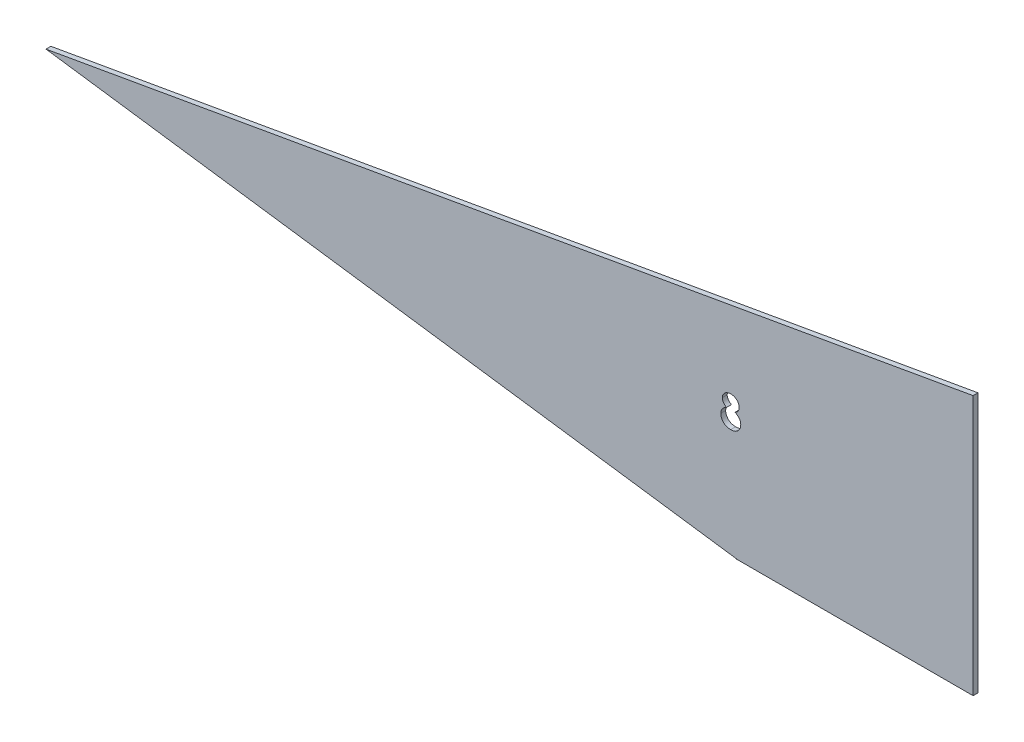
ISO-10303-21;
HEADER;
FILE_DESCRIPTION(('STEP AP214'),'2;1');
FILE_NAME('part.step','',(''),(''),'','','');
FILE_SCHEMA(('AUTOMOTIVE_DESIGN { 1 0 10303 214 1 1 1 1 }'));
ENDSEC;
DATA;
#1=APPLICATION_CONTEXT('core data for automotive mechanical design processes');
#2=APPLICATION_PROTOCOL_DEFINITION('international standard','automotive_design',2000,#1);
#3=PRODUCT_CONTEXT('',#1,'mechanical');
#4=PRODUCT('Part','Part','',(#3));
#5=PRODUCT_RELATED_PRODUCT_CATEGORY('part','',(#4));
#6=PRODUCT_DEFINITION_FORMATION('','',#4);
#7=PRODUCT_DEFINITION_CONTEXT('part definition',#1,'design');
#8=PRODUCT_DEFINITION('design','',#6,#7);
#9=PRODUCT_DEFINITION_SHAPE('','',#8);
#10=(LENGTH_UNIT() NAMED_UNIT(*) SI_UNIT(.MILLI.,.METRE.));
#11=(NAMED_UNIT(*) PLANE_ANGLE_UNIT() SI_UNIT($,.RADIAN.));
#12=(NAMED_UNIT(*) SI_UNIT($,.STERADIAN.) SOLID_ANGLE_UNIT());
#13=UNCERTAINTY_MEASURE_WITH_UNIT(LENGTH_MEASURE(1.E-05),#10,'distance_accuracy_value','');
#14=(GEOMETRIC_REPRESENTATION_CONTEXT(3) GLOBAL_UNCERTAINTY_ASSIGNED_CONTEXT((#13)) GLOBAL_UNIT_ASSIGNED_CONTEXT((#10,
#11,#12)) REPRESENTATION_CONTEXT('',''));
#15=CARTESIAN_POINT('',(0.,0.,0.));
#16=DIRECTION('',(0.,0.,1.));
#17=DIRECTION('',(1.,0.,0.));
#18=AXIS2_PLACEMENT_3D('',#15,#16,#17);
#19=CARTESIAN_POINT('',(-105.782232215349,263.577393181168,701.675));
#20=CARTESIAN_POINT('',(-105.626302265862,263.496088020879,701.675));
#21=CARTESIAN_POINT('',(-105.322186788924,263.337515805085,701.675));
#22=CARTESIAN_POINT('',(-104.889059412808,263.082186871524,701.675));
#23=CARTESIAN_POINT('',(-104.493227620286,262.81308676275,701.675));
#24=CARTESIAN_POINT('',(-104.123708991126,262.542925870805,701.675));
#25=CARTESIAN_POINT('',(-103.786995610307,262.261357882477,701.675));
#26=CARTESIAN_POINT('',(-103.486852448887,261.967263132259,701.675));
#27=CARTESIAN_POINT('',(-103.215865546191,261.667982487156,701.675));
#28=CARTESIAN_POINT('',(-102.979499764763,261.358448071402,701.675));
#29=CARTESIAN_POINT('',(-102.771599839192,261.03948222419,701.675));
#30=CARTESIAN_POINT('',(-102.591919503298,260.710247752345,701.675));
#31=CARTESIAN_POINT('',(-102.438337299309,260.371466178536,701.675));
#32=CARTESIAN_POINT('',(-102.316619018523,260.019439432744,701.675));
#33=CARTESIAN_POINT('',(-102.216351838035,259.659338580005,701.675));
#34=CARTESIAN_POINT('',(-102.147360330593,259.286513850209,701.675));
#35=CARTESIAN_POINT('',(-102.110256820757,258.903421937621,701.675));
#36=CARTESIAN_POINT('',(-102.103241993313,258.644514467027,701.675));
#37=CARTESIAN_POINT('',(-102.099690148042,258.513420825398,701.675));
#38=B_SPLINE_CURVE_WITH_KNOTS('',3,(#19,#20,#21,#22,#23,#24,#25,#26,#27,#28,#29,#30,#31,#32,#33,
#34,#35,#36,#37),.UNSPECIFIED.,.F.,.F.,(4,1,1,1,1,1,1,1,1,1,1,1,1,1,1,1,4),(0.,
0.0795248295850149,0.155099976349537,0.227219820073269,0.295910504191472,0.362055880947179,
0.425520116912639,0.485812719225311,0.544494706001814,0.601459635722228,0.657840593796651,
0.713974472193142,0.769467951597453,0.826129967181328,0.882885359309069,0.940700881666205,1.),.UNSPECIFIED.);
#39=DIRECTION('',(0.,0.,1.));
#40=VECTOR('',#39,1.);
#41=SURFACE_OF_LINEAR_EXTRUSION('',#38,#40);
#42=DIRECTION('',(0.,0.,1.));
#43=VECTOR('',#42,1.);
#44=CARTESIAN_POINT('',(-105.782232215349,263.577393181168,701.675));
#45=LINE('',#44,#43);
#46=CARTESIAN_POINT('',(-105.782232215349,263.577393181168,698.5));
#47=VERTEX_POINT('',#46);
#48=CARTESIAN_POINT('',(-105.782232215349,263.577393181168,701.675));
#49=VERTEX_POINT('',#48);
#50=EDGE_CURVE('E11',#47,#49,#45,.T.);
#51=ORIENTED_EDGE('',*,*,#50,.F.);
#52=CARTESIAN_POINT('',(-105.782232215349,263.577393181168,698.5));
#53=CARTESIAN_POINT('',(-105.626302265862,263.496088020879,698.5));
#54=CARTESIAN_POINT('',(-105.322186788924,263.337515805085,698.5));
#55=CARTESIAN_POINT('',(-104.889059412808,263.082186871524,698.5));
#56=CARTESIAN_POINT('',(-104.493227620286,262.81308676275,698.5));
#57=CARTESIAN_POINT('',(-104.123708991126,262.542925870805,698.5));
#58=CARTESIAN_POINT('',(-103.786995610307,262.261357882477,698.5));
#59=CARTESIAN_POINT('',(-103.486852448887,261.967263132259,698.5));
#60=CARTESIAN_POINT('',(-103.215865546191,261.667982487156,698.5));
#61=CARTESIAN_POINT('',(-102.979499764763,261.358448071402,698.5));
#62=CARTESIAN_POINT('',(-102.771599839192,261.03948222419,698.5));
#63=CARTESIAN_POINT('',(-102.591919503298,260.710247752345,698.5));
#64=CARTESIAN_POINT('',(-102.438337299309,260.371466178536,698.5));
#65=CARTESIAN_POINT('',(-102.316619018523,260.019439432744,698.5));
#66=CARTESIAN_POINT('',(-102.216351838035,259.659338580005,698.5));
#67=CARTESIAN_POINT('',(-102.147360330593,259.286513850209,698.5));
#68=CARTESIAN_POINT('',(-102.110256820757,258.903421937621,698.5));
#69=CARTESIAN_POINT('',(-102.103241993313,258.644514467027,698.5));
#70=CARTESIAN_POINT('',(-102.099690148042,258.513420825398,698.5));
#71=B_SPLINE_CURVE_WITH_KNOTS('',3,(#52,#53,#54,#55,#56,#57,#58,#59,#60,#61,#62,#63,#64,#65,#66,
#67,#68,#69,#70),.UNSPECIFIED.,.F.,.F.,(4,1,1,1,1,1,1,1,1,1,1,1,1,1,1,1,4),(0.,
0.0795248295850149,0.155099976349537,0.227219820073269,0.295910504191472,0.362055880947179,
0.425520116912639,0.485812719225311,0.544494706001814,0.601459635722228,0.657840593796651,
0.713974472193142,0.769467951597453,0.826129967181328,0.882885359309069,0.940700881666205,1.),.UNSPECIFIED.);
#72=CARTESIAN_POINT('',(-102.099690148042,258.513420825398,698.5));
#73=VERTEX_POINT('',#72);
#74=EDGE_CURVE('E140',#47,#73,#71,.T.);
#75=ORIENTED_EDGE('',*,*,#74,.T.);
#76=DIRECTION('',(0.,0.,1.));
#77=VECTOR('',#76,1.);
#78=CARTESIAN_POINT('',(-102.099690148042,258.513420825398,701.675));
#79=LINE('',#78,#77);
#80=CARTESIAN_POINT('',(-102.099690148042,258.513420825398,701.675));
#81=VERTEX_POINT('',#80);
#82=EDGE_CURVE('E63',#73,#81,#79,.T.);
#83=ORIENTED_EDGE('',*,*,#82,.T.);
#84=EDGE_CURVE('E272',#49,#81,#38,.T.);
#85=ORIENTED_EDGE('',*,*,#84,.F.);
#86=EDGE_LOOP('',(#51,#75,#83,#85));
#87=FACE_BOUND('',#86,.T.);
#88=ADVANCED_FACE('F51',(#87),#41,.T.);
#89=CARTESIAN_POINT('',(-102.099690148042,258.513420825398,701.675));
#90=CARTESIAN_POINT('',(-102.103888879835,258.330008880678,701.675));
#91=CARTESIAN_POINT('',(-102.112199745486,257.966967822991,701.675));
#92=CARTESIAN_POINT('',(-102.184589658533,257.43113970184,701.675));
#93=CARTESIAN_POINT('',(-102.292973155712,256.91073843163,701.675));
#94=CARTESIAN_POINT('',(-102.451248786829,256.40587810305,701.675));
#95=CARTESIAN_POINT('',(-102.656517385596,255.91934451386,701.675));
#96=CARTESIAN_POINT('',(-102.909484164286,255.450721189835,701.675));
#97=CARTESIAN_POINT('',(-103.195839438013,254.992327521331,701.675));
#98=CARTESIAN_POINT('',(-103.425812339978,254.71028192107,701.675));
#99=CARTESIAN_POINT('',(-103.542178128811,254.567567460014,701.675));
#100=B_SPLINE_CURVE_WITH_KNOTS('',3,(#89,#90,#91,#92,#93,#94,#95,#96,#97,#98,#99),.UNSPECIFIED.,
.F.,.F.,(4,1,1,1,1,1,1,1,4),(0.,0.128158185527675,0.253673136153171,0.377325305973494,
0.499384554764616,0.622918368042345,0.745839393104584,0.871395285014032,1.),.UNSPECIFIED.);
#101=DIRECTION('',(0.,0.,1.));
#102=VECTOR('',#101,1.);
#103=SURFACE_OF_LINEAR_EXTRUSION('',#100,#102);
#104=ORIENTED_EDGE('',*,*,#82,.F.);
#105=CARTESIAN_POINT('',(-102.099690148042,258.513420825398,698.5));
#106=CARTESIAN_POINT('',(-102.103888879835,258.330008880678,698.5));
#107=CARTESIAN_POINT('',(-102.112199745486,257.966967822991,698.5));
#108=CARTESIAN_POINT('',(-102.184589658533,257.43113970184,698.5));
#109=CARTESIAN_POINT('',(-102.292973155712,256.91073843163,698.5));
#110=CARTESIAN_POINT('',(-102.451248786829,256.40587810305,698.5));
#111=CARTESIAN_POINT('',(-102.656517385596,255.91934451386,698.5));
#112=CARTESIAN_POINT('',(-102.909484164286,255.450721189835,698.5));
#113=CARTESIAN_POINT('',(-103.195839438013,254.992327521331,698.5));
#114=CARTESIAN_POINT('',(-103.425812339978,254.71028192107,698.5));
#115=CARTESIAN_POINT('',(-103.542178128811,254.567567460014,698.5));
#116=B_SPLINE_CURVE_WITH_KNOTS('',3,(#105,#106,#107,#108,#109,#110,#111,#112,#113,#114,#115),
.UNSPECIFIED.,.F.,.F.,(4,1,1,1,1,1,1,1,4),(0.,0.128158185527675,0.253673136153171,
0.377325305973494,0.499384554764616,0.622918368042345,0.745839393104584,0.871395285014032,1.),.UNSPECIFIED.);
#117=CARTESIAN_POINT('',(-103.542178128811,254.567567460014,698.5));
#118=VERTEX_POINT('',#117);
#119=EDGE_CURVE('E202',#73,#118,#116,.T.);
#120=ORIENTED_EDGE('',*,*,#119,.T.);
#121=DIRECTION('',(0.,0.,1.));
#122=VECTOR('',#121,1.);
#123=CARTESIAN_POINT('',(-103.542178128811,254.567567460014,701.675));
#124=LINE('',#123,#122);
#125=CARTESIAN_POINT('',(-103.542178128811,254.567567460014,701.675));
#126=VERTEX_POINT('',#125);
#127=EDGE_CURVE('E263',#118,#126,#124,.T.);
#128=ORIENTED_EDGE('',*,*,#127,.T.);
#129=EDGE_CURVE('E281',#81,#126,#100,.T.);
#130=ORIENTED_EDGE('',*,*,#129,.F.);
#131=EDGE_LOOP('',(#104,#120,#128,#130));
#132=FACE_BOUND('',#131,.T.);
#133=ADVANCED_FACE('F285',(#132),#103,.T.);
#134=CARTESIAN_POINT('',(-103.542178128811,254.567567460014,701.675));
#135=CARTESIAN_POINT('',(-103.69368808181,254.401049917632,701.675));
#136=CARTESIAN_POINT('',(-103.994835737299,254.070072536321,701.675));
#137=CARTESIAN_POINT('',(-104.510725671896,253.640354556228,701.675));
#138=CARTESIAN_POINT('',(-105.076901925237,253.279224282664,701.675));
#139=CARTESIAN_POINT('',(-105.691173707171,252.984918685191,701.675));
#140=CARTESIAN_POINT('',(-106.35189901625,252.755851367328,701.675));
#141=CARTESIAN_POINT('',(-107.058937069915,252.591245662686,701.675));
#142=CARTESIAN_POINT('',(-107.813666245086,252.496962155092,701.675));
#143=CARTESIAN_POINT('',(-108.332400309301,252.483333296871,701.675));
#144=CARTESIAN_POINT('',(-108.598518273041,252.476341498475,701.675));
#145=B_SPLINE_CURVE_WITH_KNOTS('',3,(#134,#135,#136,#137,#138,#139,#140,#141,#142,#143,#144),
.UNSPECIFIED.,.F.,.F.,(4,1,1,1,1,1,1,1,4),(0.,0.119283450373374,0.237092882068634,
0.35479604421513,0.474576300940853,0.597460065814977,0.724926154615615,0.858883199192766,1.),.UNSPECIFIED.);
#146=DIRECTION('',(0.,0.,1.));
#147=VECTOR('',#146,1.);
#148=SURFACE_OF_LINEAR_EXTRUSION('',#145,#147);
#149=ORIENTED_EDGE('',*,*,#127,.F.);
#150=CARTESIAN_POINT('',(-103.542178128811,254.567567460014,698.5));
#151=CARTESIAN_POINT('',(-103.69368808181,254.401049917632,698.5));
#152=CARTESIAN_POINT('',(-103.994835737299,254.070072536321,698.5));
#153=CARTESIAN_POINT('',(-104.510725671896,253.640354556228,698.5));
#154=CARTESIAN_POINT('',(-105.076901925237,253.279224282664,698.5));
#155=CARTESIAN_POINT('',(-105.691173707171,252.984918685191,698.5));
#156=CARTESIAN_POINT('',(-106.35189901625,252.755851367328,698.5));
#157=CARTESIAN_POINT('',(-107.058937069915,252.591245662686,698.5));
#158=CARTESIAN_POINT('',(-107.813666245086,252.496962155092,698.5));
#159=CARTESIAN_POINT('',(-108.332400309301,252.483333296871,698.5));
#160=CARTESIAN_POINT('',(-108.598518273041,252.476341498475,698.5));
#161=B_SPLINE_CURVE_WITH_KNOTS('',3,(#150,#151,#152,#153,#154,#155,#156,#157,#158,#159,#160),
.UNSPECIFIED.,.F.,.F.,(4,1,1,1,1,1,1,1,4),(0.,0.119283450373374,0.237092882068634,
0.35479604421513,0.474576300940853,0.597460065814977,0.724926154615615,0.858883199192766,1.),.UNSPECIFIED.);
#162=CARTESIAN_POINT('',(-108.598518273041,252.476341498475,698.5));
#163=VERTEX_POINT('',#162);
#164=EDGE_CURVE('E193',#118,#163,#161,.T.);
#165=ORIENTED_EDGE('',*,*,#164,.T.);
#166=DIRECTION('',(0.,0.,1.));
#167=VECTOR('',#166,1.);
#168=CARTESIAN_POINT('',(-108.598518273041,252.476341498475,701.675));
#169=LINE('',#168,#167);
#170=CARTESIAN_POINT('',(-108.598518273041,252.476341498475,701.675));
#171=VERTEX_POINT('',#170);
#172=EDGE_CURVE('E259',#163,#171,#169,.T.);
#173=ORIENTED_EDGE('',*,*,#172,.T.);
#174=EDGE_CURVE('E287',#126,#171,#145,.T.);
#175=ORIENTED_EDGE('',*,*,#174,.F.);
#176=EDGE_LOOP('',(#149,#165,#173,#175));
#177=FACE_BOUND('',#176,.T.);
#178=ADVANCED_FACE('F308',(#177),#148,.T.);
#179=CARTESIAN_POINT('',(-108.598518273042,252.476341498475,701.675));
#180=CARTESIAN_POINT('',(-108.85440543108,252.482614271343,701.675));
#181=CARTESIAN_POINT('',(-109.352335849562,252.494820450202,701.675));
#182=CARTESIAN_POINT('',(-110.077095154462,252.577521570645,701.675));
#183=CARTESIAN_POINT('',(-110.752679291763,252.722453244994,701.675));
#184=CARTESIAN_POINT('',(-111.383016404931,252.920816047161,701.675));
#185=CARTESIAN_POINT('',(-111.964306435821,253.178863146996,701.675));
#186=CARTESIAN_POINT('',(-112.494893029348,253.500037486036,701.675));
#187=CARTESIAN_POINT('',(-112.982431364044,253.87141147837,701.675));
#188=CARTESIAN_POINT('',(-113.412125741597,254.30365096115,701.675));
#189=CARTESIAN_POINT('',(-113.793607128872,254.766608809077,701.675));
#190=CARTESIAN_POINT('',(-114.128713246283,255.244228285061,701.675));
#191=CARTESIAN_POINT('',(-114.407246445127,255.736552988238,701.675));
#192=CARTESIAN_POINT('',(-114.643069635507,256.236241929635,701.675));
#193=CARTESIAN_POINT('',(-114.823598444686,256.750298854263,701.675));
#194=CARTESIAN_POINT('',(-114.948632903759,257.276078925747,701.675));
#195=CARTESIAN_POINT('',(-115.02804045591,257.812663774699,701.675));
#196=CARTESIAN_POINT('',(-115.038605775879,258.174786058947,701.675));
#197=CARTESIAN_POINT('',(-115.043920917272,258.35696048886,701.675));
#198=B_SPLINE_CURVE_WITH_KNOTS('',3,(#179,#180,#181,#182,#183,#184,#185,#186,#187,#188,#189,
#190,#191,#192,#193,#194,#195,#196,#197),.UNSPECIFIED.,.F.,.F.,(4,1,1,1,1,1,1,1,1,1,1,1,1,1,1,1,
4),(0.,0.0785564333527024,0.152862840142093,0.223559693438289,0.29037494397821,
0.355403072822205,0.418291157044094,0.480388563775648,0.543072615206278,0.604923944462097,
0.664398309113301,0.721942554736705,0.778374891054674,0.833829940650944,0.888861236318888,
0.94408893957789,1.),.UNSPECIFIED.);
#199=DIRECTION('',(0.,0.,1.));
#200=VECTOR('',#199,1.);
#201=SURFACE_OF_LINEAR_EXTRUSION('',#198,#200);
#202=ORIENTED_EDGE('',*,*,#172,.F.);
#203=CARTESIAN_POINT('',(-108.598518273042,252.476341498475,698.5));
#204=CARTESIAN_POINT('',(-108.85440543108,252.482614271343,698.5));
#205=CARTESIAN_POINT('',(-109.352335849562,252.494820450202,698.5));
#206=CARTESIAN_POINT('',(-110.077095154462,252.577521570645,698.5));
#207=CARTESIAN_POINT('',(-110.752679291763,252.722453244994,698.5));
#208=CARTESIAN_POINT('',(-111.383016404931,252.920816047161,698.5));
#209=CARTESIAN_POINT('',(-111.964306435821,253.178863146996,698.5));
#210=CARTESIAN_POINT('',(-112.494893029348,253.500037486036,698.5));
#211=CARTESIAN_POINT('',(-112.982431364044,253.87141147837,698.5));
#212=CARTESIAN_POINT('',(-113.412125741597,254.30365096115,698.5));
#213=CARTESIAN_POINT('',(-113.793607128872,254.766608809077,698.5));
#214=CARTESIAN_POINT('',(-114.128713246283,255.244228285061,698.5));
#215=CARTESIAN_POINT('',(-114.407246445127,255.736552988238,698.5));
#216=CARTESIAN_POINT('',(-114.643069635507,256.236241929635,698.5));
#217=CARTESIAN_POINT('',(-114.823598444686,256.750298854263,698.5));
#218=CARTESIAN_POINT('',(-114.948632903759,257.276078925747,698.5));
#219=CARTESIAN_POINT('',(-115.02804045591,257.812663774699,698.5));
#220=CARTESIAN_POINT('',(-115.038605775879,258.174786058947,698.5));
#221=CARTESIAN_POINT('',(-115.043920917272,258.35696048886,698.5));
#222=B_SPLINE_CURVE_WITH_KNOTS('',3,(#203,#204,#205,#206,#207,#208,#209,#210,#211,#212,#213,
#214,#215,#216,#217,#218,#219,#220,#221),.UNSPECIFIED.,.F.,.F.,(4,1,1,1,1,1,1,1,1,1,1,1,1,1,1,1,
4),(0.,0.0785564333527024,0.152862840142093,0.223559693438289,0.29037494397821,
0.355403072822205,0.418291157044094,0.480388563775648,0.543072615206278,0.604923944462097,
0.664398309113301,0.721942554736705,0.778374891054674,0.833829940650944,0.888861236318888,
0.94408893957789,1.),.UNSPECIFIED.);
#223=CARTESIAN_POINT('',(-115.043920917272,258.35696048886,698.5));
#224=VERTEX_POINT('',#223);
#225=EDGE_CURVE('E184',#163,#224,#222,.T.);
#226=ORIENTED_EDGE('',*,*,#225,.T.);
#227=DIRECTION('',(0.,0.,1.));
#228=VECTOR('',#227,1.);
#229=CARTESIAN_POINT('',(-115.043920917272,258.35696048886,701.675));
#230=LINE('',#229,#228);
#231=CARTESIAN_POINT('',(-115.043920917272,258.35696048886,701.675));
#232=VERTEX_POINT('',#231);
#233=EDGE_CURVE('E255',#224,#232,#230,.T.);
#234=ORIENTED_EDGE('',*,*,#233,.T.);
#235=EDGE_CURVE('E290',#171,#232,#198,.T.);
#236=ORIENTED_EDGE('',*,*,#235,.F.);
#237=EDGE_LOOP('',(#202,#226,#234,#236));
#238=FACE_BOUND('',#237,.T.);
#239=ADVANCED_FACE('F329',(#238),#201,.T.);
#240=CARTESIAN_POINT('',(-115.043920917272,258.35696048886,701.675));
#241=CARTESIAN_POINT('',(-115.040775593387,258.49063266266,701.675));
#242=CARTESIAN_POINT('',(-115.034559323216,258.754816059041,701.675));
#243=CARTESIAN_POINT('',(-114.991534363559,259.145119688708,701.675));
#244=CARTESIAN_POINT('',(-114.922364024179,259.525010079408,701.675));
#245=CARTESIAN_POINT('',(-114.828423266489,259.895890412852,701.675));
#246=CARTESIAN_POINT('',(-114.701109250997,260.255060596143,701.675));
#247=CARTESIAN_POINT('',(-114.547391354882,260.604222460027,701.675));
#248=CARTESIAN_POINT('',(-114.368147442114,260.943770198566,701.675));
#249=CARTESIAN_POINT('',(-114.160877100903,261.275560679812,701.675));
#250=CARTESIAN_POINT('',(-113.919747513124,261.594944882089,701.675));
#251=CARTESIAN_POINT('',(-113.64671393357,261.907343081322,701.675));
#252=CARTESIAN_POINT('',(-113.336319391264,262.207907815312,701.675));
#253=CARTESIAN_POINT('',(-112.992016990677,262.500311299501,701.675));
#254=CARTESIAN_POINT('',(-112.617741425872,262.789740528434,701.675));
#255=CARTESIAN_POINT('',(-112.203771152802,263.060553851304,701.675));
#256=CARTESIAN_POINT('',(-111.761080352398,263.331923630942,701.675));
#257=CARTESIAN_POINT('',(-111.446453787593,263.494166087957,701.675));
#258=CARTESIAN_POINT('',(-111.28505673458,263.577393181168,701.675));
#259=B_SPLINE_CURVE_WITH_KNOTS('',3,(#240,#241,#242,#243,#244,#245,#246,#247,#248,#249,#250,
#251,#252,#253,#254,#255,#256,#257,#258),.UNSPECIFIED.,.F.,.F.,(4,1,1,1,1,1,1,1,1,1,1,1,1,1,1,1,
4),(0.,0.0588535860286685,0.11631545896335,0.17267484341146,0.228780386880904,0.284580359125279,
0.340256506384547,0.396629805012459,0.453507262875195,0.512318189779994,0.572648444056831,
0.636021935821799,0.702362946389193,0.771483056056928,0.844184477489902,0.920069793972155,1.),.UNSPECIFIED.);
#260=DIRECTION('',(0.,0.,1.));
#261=VECTOR('',#260,1.);
#262=SURFACE_OF_LINEAR_EXTRUSION('',#259,#261);
#263=ORIENTED_EDGE('',*,*,#233,.F.);
#264=CARTESIAN_POINT('',(-115.043920917272,258.35696048886,698.5));
#265=CARTESIAN_POINT('',(-115.040775593387,258.49063266266,698.5));
#266=CARTESIAN_POINT('',(-115.034559323216,258.754816059041,698.5));
#267=CARTESIAN_POINT('',(-114.991534363559,259.145119688708,698.5));
#268=CARTESIAN_POINT('',(-114.922364024179,259.525010079408,698.5));
#269=CARTESIAN_POINT('',(-114.828423266489,259.895890412852,698.5));
#270=CARTESIAN_POINT('',(-114.701109250997,260.255060596143,698.5));
#271=CARTESIAN_POINT('',(-114.547391354882,260.604222460027,698.5));
#272=CARTESIAN_POINT('',(-114.368147442114,260.943770198566,698.5));
#273=CARTESIAN_POINT('',(-114.160877100903,261.275560679812,698.5));
#274=CARTESIAN_POINT('',(-113.919747513124,261.594944882089,698.5));
#275=CARTESIAN_POINT('',(-113.64671393357,261.907343081322,698.5));
#276=CARTESIAN_POINT('',(-113.336319391264,262.207907815312,698.5));
#277=CARTESIAN_POINT('',(-112.992016990677,262.500311299501,698.5));
#278=CARTESIAN_POINT('',(-112.617741425872,262.789740528434,698.5));
#279=CARTESIAN_POINT('',(-112.203771152802,263.060553851304,698.5));
#280=CARTESIAN_POINT('',(-111.761080352398,263.331923630942,698.5));
#281=CARTESIAN_POINT('',(-111.446453787593,263.494166087957,698.5));
#282=CARTESIAN_POINT('',(-111.28505673458,263.577393181168,698.5));
#283=B_SPLINE_CURVE_WITH_KNOTS('',3,(#264,#265,#266,#267,#268,#269,#270,#271,#272,#273,#274,
#275,#276,#277,#278,#279,#280,#281,#282),.UNSPECIFIED.,.F.,.F.,(4,1,1,1,1,1,1,1,1,1,1,1,1,1,1,1,
4),(0.,0.0588535860286685,0.11631545896335,0.17267484341146,0.228780386880904,0.284580359125279,
0.340256506384547,0.396629805012459,0.453507262875195,0.512318189779994,0.572648444056831,
0.636021935821799,0.702362946389193,0.771483056056928,0.844184477489902,0.920069793972155,1.),.UNSPECIFIED.);
#284=CARTESIAN_POINT('',(-111.28505673458,263.577393181168,698.5));
#285=VERTEX_POINT('',#284);
#286=EDGE_CURVE('E175',#224,#285,#283,.T.);
#287=ORIENTED_EDGE('',*,*,#286,.T.);
#288=DIRECTION('',(0.,0.,1.));
#289=VECTOR('',#288,1.);
#290=CARTESIAN_POINT('',(-111.28505673458,263.577393181168,701.675));
#291=LINE('',#290,#289);
#292=CARTESIAN_POINT('',(-111.28505673458,263.577393181168,701.675));
#293=VERTEX_POINT('',#292);
#294=EDGE_CURVE('E251',#285,#293,#291,.T.);
#295=ORIENTED_EDGE('',*,*,#294,.T.);
#296=EDGE_CURVE('E515',#232,#293,#259,.T.);
#297=ORIENTED_EDGE('',*,*,#296,.F.);
#298=EDGE_LOOP('',(#263,#287,#295,#297));
#299=FACE_BOUND('',#298,.T.);
#300=ADVANCED_FACE('F337',(#299),#262,.T.);
#301=CARTESIAN_POINT('',(-111.28505673458,263.577393181168,701.675));
#302=CARTESIAN_POINT('',(-111.505989788154,263.697869564655,701.675));
#303=CARTESIAN_POINT('',(-111.933778018924,263.931145564367,701.675));
#304=CARTESIAN_POINT('',(-112.500213119945,264.359753180388,701.675));
#305=CARTESIAN_POINT('',(-112.986753513318,264.823962572454,701.675));
#306=CARTESIAN_POINT('',(-113.380025619195,265.333576169993,701.675));
#307=CARTESIAN_POINT('',(-113.689573031988,265.872674157276,701.675));
#308=CARTESIAN_POINT('',(-113.90194572245,266.437883588083,701.675));
#309=CARTESIAN_POINT('',(-114.045618013958,267.018724148734,701.675));
#310=CARTESIAN_POINT('',(-114.05985014454,267.415542161536,701.675));
#311=CARTESIAN_POINT('',(-114.066997840349,267.614833085014,701.675));
#312=B_SPLINE_CURVE_WITH_KNOTS('',3,(#301,#302,#303,#304,#305,#306,#307,#308,#309,#310,#311),
.UNSPECIFIED.,.F.,.F.,(4,1,1,1,1,1,1,1,4),(0.,0.145860060391663,0.282425903075821,
0.410850400357554,0.535029421347933,0.654701078125942,0.7701334325965,0.884555844198861,1.),.UNSPECIFIED.);
#313=DIRECTION('',(0.,0.,1.));
#314=VECTOR('',#313,1.);
#315=SURFACE_OF_LINEAR_EXTRUSION('',#312,#314);
#316=ORIENTED_EDGE('',*,*,#294,.F.);
#317=CARTESIAN_POINT('',(-111.28505673458,263.577393181168,698.5));
#318=CARTESIAN_POINT('',(-111.505989788154,263.697869564655,698.5));
#319=CARTESIAN_POINT('',(-111.933778018924,263.931145564367,698.5));
#320=CARTESIAN_POINT('',(-112.500213119945,264.359753180388,698.5));
#321=CARTESIAN_POINT('',(-112.986753513318,264.823962572454,698.5));
#322=CARTESIAN_POINT('',(-113.380025619195,265.333576169993,698.5));
#323=CARTESIAN_POINT('',(-113.689573031988,265.872674157276,698.5));
#324=CARTESIAN_POINT('',(-113.90194572245,266.437883588083,698.5));
#325=CARTESIAN_POINT('',(-114.045618013958,267.018724148734,698.5));
#326=CARTESIAN_POINT('',(-114.05985014454,267.415542161536,698.5));
#327=CARTESIAN_POINT('',(-114.066997840349,267.614833085014,698.5));
#328=B_SPLINE_CURVE_WITH_KNOTS('',3,(#317,#318,#319,#320,#321,#322,#323,#324,#325,#326,#327),
.UNSPECIFIED.,.F.,.F.,(4,1,1,1,1,1,1,1,4),(0.,0.145860060391663,0.282425903075821,
0.410850400357554,0.535029421347933,0.654701078125942,0.7701334325965,0.884555844198861,1.),.UNSPECIFIED.);
#329=CARTESIAN_POINT('',(-114.066997840349,267.614833085014,698.5));
#330=VERTEX_POINT('',#329);
#331=EDGE_CURVE('E166',#285,#330,#328,.T.);
#332=ORIENTED_EDGE('',*,*,#331,.T.);
#333=DIRECTION('',(0.,0.,1.));
#334=VECTOR('',#333,1.);
#335=CARTESIAN_POINT('',(-114.066997840349,267.614833085014,701.675));
#336=LINE('',#335,#334);
#337=CARTESIAN_POINT('',(-114.066997840349,267.614833085014,701.675));
#338=VERTEX_POINT('',#337);
#339=EDGE_CURVE('E248',#330,#338,#336,.T.);
#340=ORIENTED_EDGE('',*,*,#339,.T.);
#341=EDGE_CURVE('E505',#293,#338,#312,.T.);
#342=ORIENTED_EDGE('',*,*,#341,.F.);
#343=EDGE_LOOP('',(#316,#332,#340,#342));
#344=FACE_BOUND('',#343,.T.);
#345=ADVANCED_FACE('F345',(#344),#315,.T.);
#346=CARTESIAN_POINT('',(-114.066997840349,267.614833085014,701.675));
#347=CARTESIAN_POINT('',(-114.058096460617,267.817838367063,701.675));
#348=CARTESIAN_POINT('',(-114.040203134988,268.225914387328,701.675));
#349=CARTESIAN_POINT('',(-113.89551391866,268.83337057283,701.675));
#350=CARTESIAN_POINT('',(-113.65972898521,269.429997876748,701.675));
#351=CARTESIAN_POINT('',(-113.339030415753,270.012904542242,701.675));
#352=CARTESIAN_POINT('',(-112.939594282156,270.562362139189,701.675));
#353=CARTESIAN_POINT('',(-112.460369511276,271.055163575398,701.675));
#354=CARTESIAN_POINT('',(-111.912800138581,271.486844644352,701.675));
#355=CARTESIAN_POINT('',(-111.299619462462,271.84920924174,701.675));
#356=CARTESIAN_POINT('',(-110.639747950826,272.144123155998,701.675));
#357=CARTESIAN_POINT('',(-109.943520939403,272.347568571625,701.675));
#358=CARTESIAN_POINT('',(-109.223069026641,272.48057086399,701.675));
#359=CARTESIAN_POINT('',(-108.73268001133,272.495629369953,701.675));
#360=CARTESIAN_POINT('',(-108.484035099965,272.503264575399,701.675));
#361=B_SPLINE_CURVE_WITH_KNOTS('',3,(#346,#347,#348,#349,#350,#351,#352,#353,#354,#355,#356,
#357,#358,#359,#360),.UNSPECIFIED.,.F.,.F.,(4,1,1,1,1,1,1,1,1,1,1,1,4),(0.,0.0740584262733843,
0.148870352316877,0.226667668369178,0.307734759451111,0.391157203805982,0.473929355542552,
0.557927751515056,0.644989290051361,0.733364055517616,0.82109204218416,0.909287214997338,1.),.UNSPECIFIED.);
#362=DIRECTION('',(0.,0.,1.));
#363=VECTOR('',#362,1.);
#364=SURFACE_OF_LINEAR_EXTRUSION('',#361,#363);
#365=ORIENTED_EDGE('',*,*,#339,.F.);
#366=CARTESIAN_POINT('',(-114.066997840349,267.614833085014,698.5));
#367=CARTESIAN_POINT('',(-114.058096460617,267.817838367063,698.5));
#368=CARTESIAN_POINT('',(-114.040203134988,268.225914387328,698.5));
#369=CARTESIAN_POINT('',(-113.89551391866,268.83337057283,698.5));
#370=CARTESIAN_POINT('',(-113.65972898521,269.429997876748,698.5));
#371=CARTESIAN_POINT('',(-113.339030415753,270.012904542242,698.5));
#372=CARTESIAN_POINT('',(-112.939594282156,270.562362139189,698.5));
#373=CARTESIAN_POINT('',(-112.460369511276,271.055163575398,698.5));
#374=CARTESIAN_POINT('',(-111.912800138581,271.486844644352,698.5));
#375=CARTESIAN_POINT('',(-111.299619462462,271.84920924174,698.5));
#376=CARTESIAN_POINT('',(-110.639747950826,272.144123155998,698.5));
#377=CARTESIAN_POINT('',(-109.943520939403,272.347568571625,698.5));
#378=CARTESIAN_POINT('',(-109.223069026641,272.48057086399,698.5));
#379=CARTESIAN_POINT('',(-108.73268001133,272.495629369953,698.5));
#380=CARTESIAN_POINT('',(-108.484035099965,272.503264575399,698.5));
#381=B_SPLINE_CURVE_WITH_KNOTS('',3,(#366,#367,#368,#369,#370,#371,#372,#373,#374,#375,#376,
#377,#378,#379,#380),.UNSPECIFIED.,.F.,.F.,(4,1,1,1,1,1,1,1,1,1,1,1,4),(0.,0.0740584262733843,
0.148870352316877,0.226667668369178,0.307734759451111,0.391157203805982,0.473929355542552,
0.557927751515056,0.644989290051361,0.733364055517616,0.82109204218416,0.909287214997338,1.),.UNSPECIFIED.);
#382=CARTESIAN_POINT('',(-108.484035099965,272.503264575399,698.5));
#383=VERTEX_POINT('',#382);
#384=EDGE_CURVE('E157',#330,#383,#381,.T.);
#385=ORIENTED_EDGE('',*,*,#384,.T.);
#386=DIRECTION('',(0.,0.,1.));
#387=VECTOR('',#386,1.);
#388=CARTESIAN_POINT('',(-108.484035099965,272.503264575399,701.675));
#389=LINE('',#388,#387);
#390=CARTESIAN_POINT('',(-108.484035099965,272.503264575399,701.675));
#391=VERTEX_POINT('',#390);
#392=EDGE_CURVE('E71',#383,#391,#389,.T.);
#393=ORIENTED_EDGE('',*,*,#392,.T.);
#394=EDGE_CURVE('E245',#338,#391,#361,.T.);
#395=ORIENTED_EDGE('',*,*,#394,.F.);
#396=EDGE_LOOP('',(#365,#385,#393,#395));
#397=FACE_BOUND('',#396,.T.);
#398=ADVANCED_FACE('F354',(#397),#364,.T.);
#399=CARTESIAN_POINT('',(-108.484035099965,272.503264575399,701.675));
#400=CARTESIAN_POINT('',(-108.241807192656,272.495392336472,701.675));
#401=CARTESIAN_POINT('',(-107.764161354784,272.479869178137,701.675));
#402=CARTESIAN_POINT('',(-107.062062024677,272.350400598971,701.675));
#403=CARTESIAN_POINT('',(-106.390278048918,272.134158498639,701.675));
#404=CARTESIAN_POINT('',(-105.751126061882,271.840803611661,701.675));
#405=CARTESIAN_POINT('',(-105.156048326082,271.479468976697,701.675));
#406=CARTESIAN_POINT('',(-104.630255757144,271.041858504966,701.675));
#407=CARTESIAN_POINT('',(-104.165802703875,270.551230921757,701.675));
#408=CARTESIAN_POINT('',(-103.781621929411,270.001939938007,701.675));
#409=CARTESIAN_POINT('',(-103.465049631291,269.421273112649,701.675));
#410=CARTESIAN_POINT('',(-103.244609012356,268.813727677503,701.675));
#411=CARTESIAN_POINT('',(-103.103356125449,268.192430657128,701.675));
#412=CARTESIAN_POINT('',(-103.085539671892,267.772035235866,701.675));
#413=CARTESIAN_POINT('',(-103.076613224965,267.561407604245,701.675));
#414=B_SPLINE_CURVE_WITH_KNOTS('',3,(#399,#400,#401,#402,#403,#404,#405,#406,#407,#408,#409,
#410,#411,#412,#413),.UNSPECIFIED.,.F.,.F.,(4,1,1,1,1,1,1,1,1,1,1,1,4),(0.,0.0894097111101345,
0.176305764483106,0.262625902183418,0.349445726475656,0.435498263742955,0.518928130103714,
0.601354656578741,0.684256421718418,0.765806739796834,0.844876865710391,0.922279794848877,1.),.UNSPECIFIED.);
#415=DIRECTION('',(0.,0.,1.));
#416=VECTOR('',#415,1.);
#417=SURFACE_OF_LINEAR_EXTRUSION('',#414,#416);
#418=ORIENTED_EDGE('',*,*,#392,.F.);
#419=CARTESIAN_POINT('',(-108.484035099965,272.503264575399,698.5));
#420=CARTESIAN_POINT('',(-108.241807192656,272.495392336472,698.5));
#421=CARTESIAN_POINT('',(-107.764161354784,272.479869178137,698.5));
#422=CARTESIAN_POINT('',(-107.062062024677,272.350400598971,698.5));
#423=CARTESIAN_POINT('',(-106.390278048918,272.134158498639,698.5));
#424=CARTESIAN_POINT('',(-105.751126061882,271.840803611661,698.5));
#425=CARTESIAN_POINT('',(-105.156048326082,271.479468976697,698.5));
#426=CARTESIAN_POINT('',(-104.630255757144,271.041858504966,698.5));
#427=CARTESIAN_POINT('',(-104.165802703875,270.551230921757,698.5));
#428=CARTESIAN_POINT('',(-103.781621929411,270.001939938007,698.5));
#429=CARTESIAN_POINT('',(-103.465049631291,269.421273112649,698.5));
#430=CARTESIAN_POINT('',(-103.244609012356,268.813727677503,698.5));
#431=CARTESIAN_POINT('',(-103.103356125449,268.192430657128,698.5));
#432=CARTESIAN_POINT('',(-103.085539671892,267.772035235866,698.5));
#433=CARTESIAN_POINT('',(-103.076613224965,267.561407604245,698.5));
#434=B_SPLINE_CURVE_WITH_KNOTS('',3,(#419,#420,#421,#422,#423,#424,#425,#426,#427,#428,#429,
#430,#431,#432,#433),.UNSPECIFIED.,.F.,.F.,(4,1,1,1,1,1,1,1,1,1,1,1,4),(0.,0.0894097111101345,
0.176305764483106,0.262625902183418,0.349445726475656,0.435498263742955,0.518928130103714,
0.601354656578741,0.684256421718418,0.765806739796834,0.844876865710391,0.922279794848877,1.),.UNSPECIFIED.);
#435=CARTESIAN_POINT('',(-103.076613224965,267.561407604245,698.5));
#436=VERTEX_POINT('',#435);
#437=EDGE_CURVE('E138',#383,#436,#434,.T.);
#438=ORIENTED_EDGE('',*,*,#437,.T.);
#439=DIRECTION('',(0.,0.,1.));
#440=VECTOR('',#439,1.);
#441=CARTESIAN_POINT('',(-103.076613224965,267.561407604245,701.675));
#442=LINE('',#441,#440);
#443=CARTESIAN_POINT('',(-103.076613224965,267.561407604245,701.675));
#444=VERTEX_POINT('',#443);
#445=EDGE_CURVE('E56',#436,#444,#442,.T.);
#446=ORIENTED_EDGE('',*,*,#445,.T.);
#447=EDGE_CURVE('E440',#391,#444,#414,.T.);
#448=ORIENTED_EDGE('',*,*,#447,.F.);
#449=EDGE_LOOP('',(#418,#438,#446,#448));
#450=FACE_BOUND('',#449,.T.);
#451=ADVANCED_FACE('F143',(#450),#417,.T.);
#452=CARTESIAN_POINT('',(48.3499999999999,350.,701.675));
#453=DIRECTION('',(1.,0.,0.));
#454=DIRECTION('',(0.,1.,0.));
#455=AXIS2_PLACEMENT_3D('',#452,#453,#454);
#456=PLANE('',#455);
#457=DIRECTION('',(0.,0.,1.));
#458=VECTOR('',#457,1.);
#459=CARTESIAN_POINT('',(48.35,181.7,701.675));
#460=LINE('',#459,#458);
#461=CARTESIAN_POINT('',(48.35,181.7,698.5));
#462=VERTEX_POINT('',#461);
#463=CARTESIAN_POINT('',(48.35,181.7,701.675));
#464=VERTEX_POINT('',#463);
#465=EDGE_CURVE('E133',#462,#464,#460,.T.);
#466=ORIENTED_EDGE('',*,*,#465,.F.);
#467=DIRECTION('',(0.,1.,0.));
#468=VECTOR('',#467,1.);
#469=CARTESIAN_POINT('',(48.35,0.,698.5));
#470=LINE('',#469,#468);
#471=CARTESIAN_POINT('',(48.3499999999999,350.,698.5));
#472=VERTEX_POINT('',#471);
#473=EDGE_CURVE('E486',#462,#472,#470,.T.);
#474=ORIENTED_EDGE('',*,*,#473,.T.);
#475=DIRECTION('',(0.,0.,1.));
#476=VECTOR('',#475,1.);
#477=CARTESIAN_POINT('',(48.3499999999999,350.,701.675));
#478=LINE('',#477,#476);
#479=CARTESIAN_POINT('',(48.3499999999999,350.,701.675));
#480=VERTEX_POINT('',#479);
#481=EDGE_CURVE('E235',#472,#480,#478,.T.);
#482=ORIENTED_EDGE('',*,*,#481,.T.);
#483=DIRECTION('',(0.,1.,0.));
#484=VECTOR('',#483,1.);
#485=CARTESIAN_POINT('',(48.3499999999999,350.,701.675));
#486=LINE('',#485,#484);
#487=EDGE_CURVE('E464',#464,#480,#486,.T.);
#488=ORIENTED_EDGE('',*,*,#487,.F.);
#489=EDGE_LOOP('',(#466,#474,#482,#488));
#490=FACE_BOUND('',#489,.T.);
#491=ADVANCED_FACE('F370',(#490),#456,.T.);
#492=CARTESIAN_POINT('',(-551.988806236242,244.144070894237,701.675));
#493=DIRECTION('',(-0.173648177666935,0.984807753012207,0.));
#494=DIRECTION('',(-0.984807753012207,-0.173648177666935,0.));
#495=AXIS2_PLACEMENT_3D('',#492,#493,#494);
#496=PLANE('',#495);
#497=ORIENTED_EDGE('',*,*,#481,.F.);
#498=DIRECTION('',(-0.984807753012207,-0.173648177666935,0.));
#499=VECTOR('',#498,1.);
#500=CARTESIAN_POINT('',(-551.988806236242,244.144070894237,698.5));
#501=LINE('',#500,#499);
#502=CARTESIAN_POINT('',(-551.988806236242,244.144070894237,698.5));
#503=VERTEX_POINT('',#502);
#504=EDGE_CURVE('E149',#472,#503,#501,.T.);
#505=ORIENTED_EDGE('',*,*,#504,.T.);
#506=DIRECTION('',(0.,0.,1.));
#507=VECTOR('',#506,1.);
#508=CARTESIAN_POINT('',(-551.988806236242,244.144070894237,701.675));
#509=LINE('',#508,#507);
#510=CARTESIAN_POINT('',(-551.988806236242,244.144070894237,701.675));
#511=VERTEX_POINT('',#510);
#512=EDGE_CURVE('E230',#503,#511,#509,.T.);
#513=ORIENTED_EDGE('',*,*,#512,.T.);
#514=DIRECTION('',(-0.984807753012207,-0.173648177666935,0.));
#515=VECTOR('',#514,1.);
#516=CARTESIAN_POINT('',(-551.988806236242,244.144070894237,701.675));
#517=LINE('',#516,#515);
#518=EDGE_CURVE('E461',#480,#511,#517,.T.);
#519=ORIENTED_EDGE('',*,*,#518,.F.);
#520=EDGE_LOOP('',(#497,#505,#513,#519));
#521=FACE_BOUND('',#520,.T.);
#522=ADVANCED_FACE('F378',(#521),#496,.T.);
#523=CARTESIAN_POINT('',(-105.,181.865334794732,701.675));
#524=DIRECTION('',(-0.137996515313345,-0.990432714403848,0.));
#525=DIRECTION('',(0.990432714403848,-0.137996515313345,0.));
#526=AXIS2_PLACEMENT_3D('',#523,#524,#525);
#527=PLANE('',#526);
#528=ORIENTED_EDGE('',*,*,#512,.F.);
#529=DIRECTION('',(0.990432714403848,-0.137996515313345,0.));
#530=VECTOR('',#529,1.);
#531=CARTESIAN_POINT('',(-105.,181.865334794732,698.5));
#532=LINE('',#531,#530);
#533=CARTESIAN_POINT('',(-105.,181.865334794732,698.5));
#534=VERTEX_POINT('',#533);
#535=EDGE_CURVE('E145',#503,#534,#532,.T.);
#536=ORIENTED_EDGE('',*,*,#535,.T.);
#537=DIRECTION('',(0.,0.,1.));
#538=VECTOR('',#537,1.);
#539=CARTESIAN_POINT('',(-105.,181.865334794732,701.675));
#540=LINE('',#539,#538);
#541=CARTESIAN_POINT('',(-105.,181.865334794732,701.675));
#542=VERTEX_POINT('',#541);
#543=EDGE_CURVE('E223',#534,#542,#540,.T.);
#544=ORIENTED_EDGE('',*,*,#543,.T.);
#545=DIRECTION('',(0.990432714403848,-0.137996515313345,0.));
#546=VECTOR('',#545,1.);
#547=CARTESIAN_POINT('',(-105.,181.865334794732,701.675));
#548=LINE('',#547,#546);
#549=EDGE_CURVE('E446',#511,#542,#548,.T.);
#550=ORIENTED_EDGE('',*,*,#549,.F.);
#551=EDGE_LOOP('',(#528,#536,#544,#550));
#552=FACE_BOUND('',#551,.T.);
#553=ADVANCED_FACE('F387',(#552),#527,.T.);
#554=CARTESIAN_POINT('',(0.,0.,701.675));
#555=DIRECTION('',(-0.866025403784438,-0.500000000000001,0.));
#556=DIRECTION('',(0.500000000000001,-0.866025403784438,0.));
#557=AXIS2_PLACEMENT_3D('',#554,#555,#556);
#558=PLANE('',#557);
#559=ORIENTED_EDGE('',*,*,#543,.F.);
#560=DIRECTION('',(0.500000000000001,-0.866025403784438,0.));
#561=VECTOR('',#560,1.);
#562=CARTESIAN_POINT('',(0.,0.,698.5));
#563=LINE('',#562,#561);
#564=CARTESIAN_POINT('',(-104.904543911755,181.7,698.5));
#565=VERTEX_POINT('',#564);
#566=EDGE_CURVE('E496',#534,#565,#563,.T.);
#567=ORIENTED_EDGE('',*,*,#566,.T.);
#568=DIRECTION('',(0.,0.,1.));
#569=VECTOR('',#568,1.);
#570=CARTESIAN_POINT('',(-104.904543911755,181.7,701.675));
#571=LINE('',#570,#569);
#572=CARTESIAN_POINT('',(-104.904543911755,181.7,701.675));
#573=VERTEX_POINT('',#572);
#574=EDGE_CURVE('E231',#565,#573,#571,.T.);
#575=ORIENTED_EDGE('',*,*,#574,.T.);
#576=DIRECTION('',(0.500000000000001,-0.866025403784438,0.));
#577=VECTOR('',#576,1.);
#578=CARTESIAN_POINT('',(0.,0.,701.675));
#579=LINE('',#578,#577);
#580=EDGE_CURVE('E165',#542,#573,#579,.T.);
#581=ORIENTED_EDGE('',*,*,#580,.F.);
#582=EDGE_LOOP('',(#559,#567,#575,#581));
#583=FACE_BOUND('',#582,.T.);
#584=ADVANCED_FACE('F396',(#583),#558,.T.);
#585=CARTESIAN_POINT('',(-551.988806236242,181.7,701.675));
#586=DIRECTION('',(0.,-1.,0.));
#587=DIRECTION('',(1.,0.,0.));
#588=AXIS2_PLACEMENT_3D('',#585,#586,#587);
#589=PLANE('',#588);
#590=DIRECTION('',(1.,0.,0.));
#591=VECTOR('',#590,1.);
#592=CARTESIAN_POINT('',(0.,181.7,698.5));
#593=LINE('',#592,#591);
#594=EDGE_CURVE('E155',#565,#462,#593,.T.);
#595=ORIENTED_EDGE('',*,*,#594,.T.);
#596=ORIENTED_EDGE('',*,*,#465,.T.);
#597=DIRECTION('',(1.,0.,0.));
#598=VECTOR('',#597,1.);
#599=CARTESIAN_POINT('',(-551.988806236242,181.7,701.675));
#600=LINE('',#599,#598);
#601=EDGE_CURVE('E467',#573,#464,#600,.T.);
#602=ORIENTED_EDGE('',*,*,#601,.F.);
#603=ORIENTED_EDGE('',*,*,#574,.F.);
#604=EDGE_LOOP('',(#595,#596,#602,#603));
#605=FACE_BOUND('',#604,.T.);
#606=ADVANCED_FACE('F405',(#605),#589,.T.);
#607=CARTESIAN_POINT('',(-103.076613224965,267.561407604245,701.675));
#608=CARTESIAN_POINT('',(-103.08442133355,267.35470604811,701.675));
#609=CARTESIAN_POINT('',(-103.099756015022,266.948755940169,701.675));
#610=CARTESIAN_POINT('',(-103.228751400163,266.356973021567,701.675));
#611=CARTESIAN_POINT('',(-103.445993864191,265.80277020967,701.675));
#612=CARTESIAN_POINT('',(-103.742597808428,265.279858855716,701.675));
#613=CARTESIAN_POINT('',(-104.129179390316,264.797722418726,701.675));
#614=CARTESIAN_POINT('',(-104.600578351613,264.350229918317,701.675));
#615=CARTESIAN_POINT('',(-105.153036397546,263.933705324106,701.675));
#616=CARTESIAN_POINT('',(-105.568113506794,263.698648112828,701.675));
#617=CARTESIAN_POINT('',(-105.782232215349,263.577393181168,701.675));
#618=B_SPLINE_CURVE_WITH_KNOTS('',3,(#607,#608,#609,#610,#611,#612,#613,#614,#615,#616,#617),
.UNSPECIFIED.,.F.,.F.,(4,1,1,1,1,1,1,1,4),(0.,0.121904040869889,0.239412607602006,
0.355410104280179,0.472090728803307,0.59285898215636,0.718703467713687,0.85489238295153,1.),.UNSPECIFIED.);
#619=DIRECTION('',(0.,0.,1.));
#620=VECTOR('',#619,1.);
#621=SURFACE_OF_LINEAR_EXTRUSION('',#618,#620);
#622=CARTESIAN_POINT('',(-103.076613224965,267.561407604245,698.5));
#623=CARTESIAN_POINT('',(-103.08442133355,267.35470604811,698.5));
#624=CARTESIAN_POINT('',(-103.099756015022,266.948755940169,698.5));
#625=CARTESIAN_POINT('',(-103.228751400163,266.356973021567,698.5));
#626=CARTESIAN_POINT('',(-103.445993864191,265.80277020967,698.5));
#627=CARTESIAN_POINT('',(-103.742597808428,265.279858855716,698.5));
#628=CARTESIAN_POINT('',(-104.129179390316,264.797722418726,698.5));
#629=CARTESIAN_POINT('',(-104.600578351613,264.350229918317,698.5));
#630=CARTESIAN_POINT('',(-105.153036397546,263.933705324106,698.5));
#631=CARTESIAN_POINT('',(-105.568113506794,263.698648112828,698.5));
#632=CARTESIAN_POINT('',(-105.782232215349,263.577393181168,698.5));
#633=B_SPLINE_CURVE_WITH_KNOTS('',3,(#622,#623,#624,#625,#626,#627,#628,#629,#630,#631,#632),
.UNSPECIFIED.,.F.,.F.,(4,1,1,1,1,1,1,1,4),(0.,0.121904040869889,0.239412607602006,
0.355410104280179,0.472090728803307,0.59285898215636,0.718703467713687,0.85489238295153,1.),.UNSPECIFIED.);
#634=EDGE_CURVE('E125',#436,#47,#633,.T.);
#635=ORIENTED_EDGE('',*,*,#634,.T.);
#636=ORIENTED_EDGE('',*,*,#50,.T.);
#637=EDGE_CURVE('E128',#444,#49,#618,.T.);
#638=ORIENTED_EDGE('',*,*,#637,.F.);
#639=ORIENTED_EDGE('',*,*,#445,.F.);
#640=EDGE_LOOP('',(#635,#636,#638,#639));
#641=FACE_BOUND('',#640,.T.);
#642=ADVANCED_FACE('F53',(#641),#621,.T.);
#643=CARTESIAN_POINT('',(0.,0.,701.675));
#644=DIRECTION('',(0.,0.,1.));
#645=DIRECTION('',(1.,0.,0.));
#646=AXIS2_PLACEMENT_3D('',#643,#644,#645);
#647=PLANE('',#646);
#648=ORIENTED_EDGE('',*,*,#580,.T.);
#649=ORIENTED_EDGE('',*,*,#601,.T.);
#650=ORIENTED_EDGE('',*,*,#487,.T.);
#651=ORIENTED_EDGE('',*,*,#518,.T.);
#652=ORIENTED_EDGE('',*,*,#549,.T.);
#653=EDGE_LOOP('',(#648,#649,#650,#651,#652));
#654=FACE_BOUND('',#653,.T.);
#655=ORIENTED_EDGE('',*,*,#447,.T.);
#656=ORIENTED_EDGE('',*,*,#637,.T.);
#657=ORIENTED_EDGE('',*,*,#84,.T.);
#658=ORIENTED_EDGE('',*,*,#129,.T.);
#659=ORIENTED_EDGE('',*,*,#174,.T.);
#660=ORIENTED_EDGE('',*,*,#235,.T.);
#661=ORIENTED_EDGE('',*,*,#296,.T.);
#662=ORIENTED_EDGE('',*,*,#341,.T.);
#663=ORIENTED_EDGE('',*,*,#394,.T.);
#664=EDGE_LOOP('',(#655,#656,#657,#658,#659,#660,#661,#662,#663));
#665=FACE_BOUND('',#664,.T.);
#666=ADVANCED_FACE('F279',(#654,#665),#647,.T.);
#667=CARTESIAN_POINT('',(0.,0.,698.5));
#668=DIRECTION('',(0.,0.,1.));
#669=DIRECTION('',(1.,0.,0.));
#670=AXIS2_PLACEMENT_3D('',#667,#668,#669);
#671=PLANE('',#670);
#672=ORIENTED_EDGE('',*,*,#566,.F.);
#673=ORIENTED_EDGE('',*,*,#535,.F.);
#674=ORIENTED_EDGE('',*,*,#504,.F.);
#675=ORIENTED_EDGE('',*,*,#473,.F.);
#676=ORIENTED_EDGE('',*,*,#594,.F.);
#677=EDGE_LOOP('',(#672,#673,#674,#675,#676));
#678=FACE_BOUND('',#677,.T.);
#679=ORIENTED_EDGE('',*,*,#437,.F.);
#680=ORIENTED_EDGE('',*,*,#384,.F.);
#681=ORIENTED_EDGE('',*,*,#331,.F.);
#682=ORIENTED_EDGE('',*,*,#286,.F.);
#683=ORIENTED_EDGE('',*,*,#225,.F.);
#684=ORIENTED_EDGE('',*,*,#164,.F.);
#685=ORIENTED_EDGE('',*,*,#119,.F.);
#686=ORIENTED_EDGE('',*,*,#74,.F.);
#687=ORIENTED_EDGE('',*,*,#634,.F.);
#688=EDGE_LOOP('',(#679,#680,#681,#682,#683,#684,#685,#686,#687));
#689=FACE_BOUND('',#688,.T.);
#690=ADVANCED_FACE('F136',(#678,#689),#671,.F.);
#691=CLOSED_SHELL('',(#88,#133,#178,#239,#300,#345,#398,#451,#491,#522,#553,#584,#606,#642,#666,#690));
#692=MANIFOLD_SOLID_BREP('B2',#691);
#693=ADVANCED_BREP_SHAPE_REPRESENTATION('',(#18,#692),#14);
#694=SHAPE_DEFINITION_REPRESENTATION(#9,#693);
ENDSEC;
END-ISO-10303-21;
